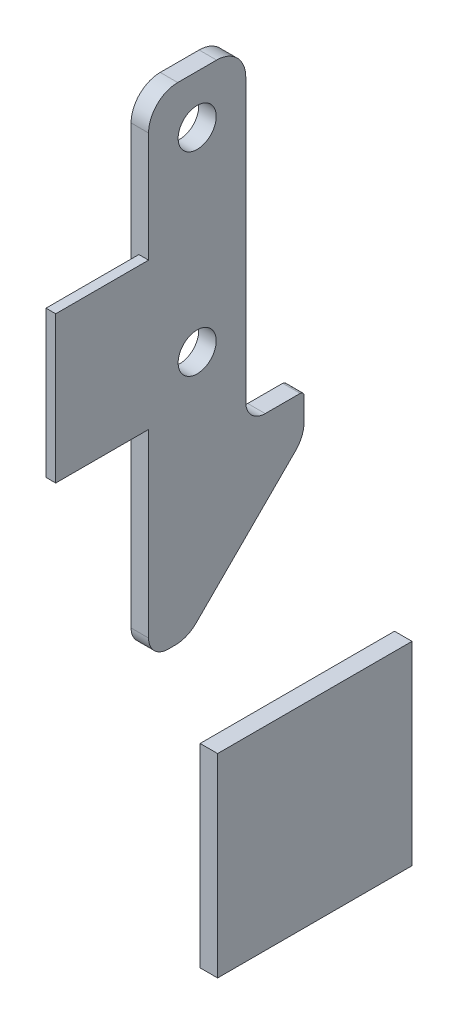
ISO-10303-21;
HEADER;
FILE_DESCRIPTION(('STEP AP214'),'2;1');
FILE_NAME('part.step','',(''),(''),'','','');
FILE_SCHEMA(('AUTOMOTIVE_DESIGN { 1 0 10303 214 1 1 1 1 }'));
ENDSEC;
DATA;
#1=APPLICATION_CONTEXT('core data for automotive mechanical design processes');
#2=APPLICATION_PROTOCOL_DEFINITION('international standard','automotive_design',2000,#1);
#3=PRODUCT_CONTEXT('',#1,'mechanical');
#4=PRODUCT('Part','Part','',(#3));
#5=PRODUCT_RELATED_PRODUCT_CATEGORY('part','',(#4));
#6=PRODUCT_DEFINITION_FORMATION('','',#4);
#7=PRODUCT_DEFINITION_CONTEXT('part definition',#1,'design');
#8=PRODUCT_DEFINITION('design','',#6,#7);
#9=PRODUCT_DEFINITION_SHAPE('','',#8);
#10=(LENGTH_UNIT() NAMED_UNIT(*) SI_UNIT(.MILLI.,.METRE.));
#11=(NAMED_UNIT(*) PLANE_ANGLE_UNIT() SI_UNIT($,.RADIAN.));
#12=(NAMED_UNIT(*) SI_UNIT($,.STERADIAN.) SOLID_ANGLE_UNIT());
#13=UNCERTAINTY_MEASURE_WITH_UNIT(LENGTH_MEASURE(1.E-05),#10,'distance_accuracy_value','');
#14=(GEOMETRIC_REPRESENTATION_CONTEXT(3) GLOBAL_UNCERTAINTY_ASSIGNED_CONTEXT((#13)) GLOBAL_UNIT_ASSIGNED_CONTEXT((#10,
#11,#12)) REPRESENTATION_CONTEXT('',''));
#15=CARTESIAN_POINT('',(0.,0.,0.));
#16=DIRECTION('',(0.,0.,1.));
#17=DIRECTION('',(1.,0.,0.));
#18=AXIS2_PLACEMENT_3D('',#15,#16,#17);
#19=CARTESIAN_POINT('',(-1.143,0.,0.));
#20=DIRECTION('',(-1.,0.,0.));
#21=DIRECTION('',(0.,0.,1.));
#22=AXIS2_PLACEMENT_3D('',#19,#20,#21);
#23=PLANE('',#22);
#24=DIRECTION('',(0.,-1.,0.));
#25=VECTOR('',#24,1.);
#26=CARTESIAN_POINT('',(-1.143,-72.1927963199012,-2.67214499586998));
#27=LINE('',#26,#25);
#28=CARTESIAN_POINT('',(-1.143,-72.1927963199012,-2.67214499586998));
#29=VERTEX_POINT('',#28);
#30=CARTESIAN_POINT('',(-1.143,-97.5927963199013,-2.67214499586998));
#31=VERTEX_POINT('',#30);
#32=EDGE_CURVE('E56',#29,#31,#27,.T.);
#33=ORIENTED_EDGE('',*,*,#32,.F.);
#34=DIRECTION('',(0.,0.,1.));
#35=VECTOR('',#34,1.);
#36=CARTESIAN_POINT('',(-1.143,-72.1927963199012,-2.67214499586998));
#37=LINE('',#36,#35);
#38=CARTESIAN_POINT('',(-1.143,-72.1927963199012,-28.07214499587));
#39=VERTEX_POINT('',#38);
#40=EDGE_CURVE('E79',#39,#29,#37,.T.);
#41=ORIENTED_EDGE('',*,*,#40,.F.);
#42=DIRECTION('',(0.,1.,0.));
#43=VECTOR('',#42,1.);
#44=CARTESIAN_POINT('',(-1.143,-72.1927963199012,-28.07214499587));
#45=LINE('',#44,#43);
#46=CARTESIAN_POINT('',(-1.143,-97.5927963199013,-28.07214499587));
#47=VERTEX_POINT('',#46);
#48=EDGE_CURVE('E84',#47,#39,#45,.T.);
#49=ORIENTED_EDGE('',*,*,#48,.F.);
#50=DIRECTION('',(0.,0.,-1.));
#51=VECTOR('',#50,1.);
#52=CARTESIAN_POINT('',(-1.143,-97.5927963199013,-2.67214499586998));
#53=LINE('',#52,#51);
#54=EDGE_CURVE('E99',#31,#47,#53,.T.);
#55=ORIENTED_EDGE('',*,*,#54,.F.);
#56=EDGE_LOOP('',(#33,#41,#49,#55));
#57=FACE_BOUND('',#56,.T.);
#58=ADVANCED_FACE('F47',(#57),#23,.T.);
#59=CARTESIAN_POINT('',(1.143,0.,0.));
#60=DIRECTION('',(1.,0.,0.));
#61=DIRECTION('',(0.,0.,-1.));
#62=AXIS2_PLACEMENT_3D('',#59,#60,#61);
#63=PLANE('',#62);
#64=DIRECTION('',(0.,-1.,0.));
#65=VECTOR('',#64,1.);
#66=CARTESIAN_POINT('',(1.143,-72.1927963199012,-2.67214499586998));
#67=LINE('',#66,#65);
#68=CARTESIAN_POINT('',(1.143,-72.1927963199012,-2.67214499586998));
#69=VERTEX_POINT('',#68);
#70=CARTESIAN_POINT('',(1.143,-97.5927963199013,-2.67214499586998));
#71=VERTEX_POINT('',#70);
#72=EDGE_CURVE('E108',#69,#71,#67,.T.);
#73=ORIENTED_EDGE('',*,*,#72,.T.);
#74=DIRECTION('',(0.,0.,-1.));
#75=VECTOR('',#74,1.);
#76=CARTESIAN_POINT('',(1.143,-97.5927963199013,-2.67214499586998));
#77=LINE('',#76,#75);
#78=CARTESIAN_POINT('',(1.143,-97.5927963199013,-28.07214499587));
#79=VERTEX_POINT('',#78);
#80=EDGE_CURVE('E97',#71,#79,#77,.T.);
#81=ORIENTED_EDGE('',*,*,#80,.T.);
#82=DIRECTION('',(0.,1.,0.));
#83=VECTOR('',#82,1.);
#84=CARTESIAN_POINT('',(1.143,-72.1927963199012,-28.07214499587));
#85=LINE('',#84,#83);
#86=CARTESIAN_POINT('',(1.143,-72.1927963199012,-28.07214499587));
#87=VERTEX_POINT('',#86);
#88=EDGE_CURVE('E100',#79,#87,#85,.T.);
#89=ORIENTED_EDGE('',*,*,#88,.T.);
#90=DIRECTION('',(0.,0.,1.));
#91=VECTOR('',#90,1.);
#92=CARTESIAN_POINT('',(1.143,-72.1927963199012,-2.67214499586998));
#93=LINE('',#92,#91);
#94=EDGE_CURVE('E105',#87,#69,#93,.T.);
#95=ORIENTED_EDGE('',*,*,#94,.T.);
#96=EDGE_LOOP('',(#73,#81,#89,#95));
#97=FACE_BOUND('',#96,.T.);
#98=ADVANCED_FACE('F107',(#97),#63,.T.);
#99=CARTESIAN_POINT('',(-37.0640244842766,-97.5927963199013,-2.67214499586998));
#100=DIRECTION('',(0.,-1.,0.));
#101=DIRECTION('',(0.,0.,-1.));
#102=AXIS2_PLACEMENT_3D('',#99,#100,#101);
#103=PLANE('',#102);
#104=DIRECTION('',(1.,0.,0.));
#105=VECTOR('',#104,1.);
#106=CARTESIAN_POINT('',(-37.0640244842766,-97.5927963199013,-2.67214499586998));
#107=LINE('',#106,#105);
#108=EDGE_CURVE('E13',#31,#71,#107,.T.);
#109=ORIENTED_EDGE('',*,*,#108,.F.);
#110=ORIENTED_EDGE('',*,*,#54,.T.);
#111=DIRECTION('',(1.,0.,0.));
#112=VECTOR('',#111,1.);
#113=CARTESIAN_POINT('',(-37.0640244842766,-97.5927963199013,-28.07214499587));
#114=LINE('',#113,#112);
#115=EDGE_CURVE('E94',#47,#79,#114,.T.);
#116=ORIENTED_EDGE('',*,*,#115,.T.);
#117=ORIENTED_EDGE('',*,*,#80,.F.);
#118=EDGE_LOOP('',(#109,#110,#116,#117));
#119=FACE_BOUND('',#118,.T.);
#120=ADVANCED_FACE('F95',(#119),#103,.T.);
#121=CARTESIAN_POINT('',(-37.0640244842766,-72.1927963199012,-28.07214499587));
#122=DIRECTION('',(0.,0.,-1.));
#123=DIRECTION('',(0.,1.,0.));
#124=AXIS2_PLACEMENT_3D('',#121,#122,#123);
#125=PLANE('',#124);
#126=ORIENTED_EDGE('',*,*,#115,.F.);
#127=ORIENTED_EDGE('',*,*,#48,.T.);
#128=DIRECTION('',(1.,0.,0.));
#129=VECTOR('',#128,1.);
#130=CARTESIAN_POINT('',(-37.0640244842766,-72.1927963199012,-28.07214499587));
#131=LINE('',#130,#129);
#132=EDGE_CURVE('E89',#39,#87,#131,.T.);
#133=ORIENTED_EDGE('',*,*,#132,.T.);
#134=ORIENTED_EDGE('',*,*,#88,.F.);
#135=EDGE_LOOP('',(#126,#127,#133,#134));
#136=FACE_BOUND('',#135,.T.);
#137=ADVANCED_FACE('F101',(#136),#125,.T.);
#138=CARTESIAN_POINT('',(-37.0640244842766,-72.1927963199012,-2.67214499586998));
#139=DIRECTION('',(0.,1.,0.));
#140=DIRECTION('',(0.,0.,1.));
#141=AXIS2_PLACEMENT_3D('',#138,#139,#140);
#142=PLANE('',#141);
#143=ORIENTED_EDGE('',*,*,#132,.F.);
#144=ORIENTED_EDGE('',*,*,#40,.T.);
#145=DIRECTION('',(1.,0.,0.));
#146=VECTOR('',#145,1.);
#147=CARTESIAN_POINT('',(-37.0640244842766,-72.1927963199012,-2.67214499586998));
#148=LINE('',#147,#146);
#149=EDGE_CURVE('E127',#29,#69,#148,.T.);
#150=ORIENTED_EDGE('',*,*,#149,.T.);
#151=ORIENTED_EDGE('',*,*,#94,.F.);
#152=EDGE_LOOP('',(#143,#144,#150,#151));
#153=FACE_BOUND('',#152,.T.);
#154=ADVANCED_FACE('F141',(#153),#142,.T.);
#155=CARTESIAN_POINT('',(-37.0640244842766,-72.1927963199012,-2.67214499586998));
#156=DIRECTION('',(0.,0.,1.));
#157=DIRECTION('',(0.,-1.,0.));
#158=AXIS2_PLACEMENT_3D('',#155,#156,#157);
#159=PLANE('',#158);
#160=ORIENTED_EDGE('',*,*,#149,.F.);
#161=ORIENTED_EDGE('',*,*,#32,.T.);
#162=ORIENTED_EDGE('',*,*,#108,.T.);
#163=ORIENTED_EDGE('',*,*,#72,.F.);
#164=EDGE_LOOP('',(#160,#161,#162,#163));
#165=FACE_BOUND('',#164,.T.);
#166=ADVANCED_FACE('F143',(#165),#159,.T.);
#167=CLOSED_SHELL('',(#58,#98,#120,#137,#154,#166));
#168=MANIFOLD_SOLID_BREP('B2',#167);
#169=CARTESIAN_POINT('',(1.143,0.,0.));
#170=DIRECTION('',(-1.,0.,0.));
#171=DIRECTION('',(0.,0.,1.));
#172=AXIS2_PLACEMENT_3D('',#169,#170,#171);
#173=PLANE('',#172);
#174=DIRECTION('',(0.,-1.,0.));
#175=VECTOR('',#174,1.);
#176=CARTESIAN_POINT('',(1.143,-57.1500000000001,6.35));
#177=LINE('',#176,#175);
#178=CARTESIAN_POINT('',(1.143,2.54,6.35));
#179=VERTEX_POINT('',#178);
#180=CARTESIAN_POINT('',(1.143,-11.8471085961858,6.35));
#181=VERTEX_POINT('',#180);
#182=EDGE_CURVE('E385',#179,#181,#177,.T.);
#183=ORIENTED_EDGE('',*,*,#182,.T.);
#184=DIRECTION('',(0.,0.,1.));
#185=VECTOR('',#184,1.);
#186=CARTESIAN_POINT('',(1.143,-11.8471085961858,6.35));
#187=LINE('',#186,#185);
#188=CARTESIAN_POINT('',(1.143,-11.8471085961858,18.4831558357814));
#189=VERTEX_POINT('',#188);
#190=EDGE_CURVE('E323',#181,#189,#187,.T.);
#191=ORIENTED_EDGE('',*,*,#190,.T.);
#192=DIRECTION('',(0.,-1.,0.));
#193=VECTOR('',#192,1.);
#194=CARTESIAN_POINT('',(1.143,-31.0059207664608,18.4831558357814));
#195=LINE('',#194,#193);
#196=CARTESIAN_POINT('',(1.143,-31.0059207664608,18.4831558357814));
#197=VERTEX_POINT('',#196);
#198=EDGE_CURVE('E344',#189,#197,#195,.T.);
#199=ORIENTED_EDGE('',*,*,#198,.T.);
#200=DIRECTION('',(0.,0.,-1.));
#201=VECTOR('',#200,1.);
#202=CARTESIAN_POINT('',(1.143,-31.0059207664608,6.35));
#203=LINE('',#202,#201);
#204=CARTESIAN_POINT('',(1.143,-31.0059207664608,6.35));
#205=VERTEX_POINT('',#204);
#206=EDGE_CURVE('E209',#197,#205,#203,.T.);
#207=ORIENTED_EDGE('',*,*,#206,.T.);
#208=CARTESIAN_POINT('',(1.143,-54.6100000000001,6.35));
#209=VERTEX_POINT('',#208);
#210=EDGE_CURVE('E213',#205,#209,#177,.T.);
#211=ORIENTED_EDGE('',*,*,#210,.T.);
#212=CARTESIAN_POINT('',(1.143,-54.6100000000001,3.81));
#213=DIRECTION('',(-1.,0.,0.));
#214=DIRECTION('',(0.,0.,1.));
#215=AXIS2_PLACEMENT_3D('',#212,#213,#214);
#216=CIRCLE('',#215,2.54);
#217=CARTESIAN_POINT('',(1.143,-57.1500000000001,3.81));
#218=VERTEX_POINT('',#217);
#219=EDGE_CURVE('E45',#209,#218,#216,.F.);
#220=ORIENTED_EDGE('',*,*,#219,.T.);
#221=DIRECTION('',(0.,0.,-1.));
#222=VECTOR('',#221,1.);
#223=CARTESIAN_POINT('',(1.143,-57.1500000000001,1.27));
#224=LINE('',#223,#222);
#225=CARTESIAN_POINT('',(1.143,-57.1500000000001,2.84815367264149));
#226=VERTEX_POINT('',#225);
#227=EDGE_CURVE('E486',#218,#226,#224,.T.);
#228=ORIENTED_EDGE('',*,*,#227,.T.);
#229=CARTESIAN_POINT('',(1.143,-53.3400000000001,2.84815367264149));
#230=DIRECTION('',(-1.,0.,0.));
#231=DIRECTION('',(0.,0.,1.));
#232=AXIS2_PLACEMENT_3D('',#229,#230,#231);
#233=CIRCLE('',#232,3.81);
#234=CARTESIAN_POINT('',(1.143,-56.0340768363208,0.15407683632074));
#235=VERTEX_POINT('',#234);
#236=EDGE_CURVE('E528',#226,#235,#233,.F.);
#237=ORIENTED_EDGE('',*,*,#236,.T.);
#238=DIRECTION('',(0.,0.707106781186549,-0.707106781186546));
#239=VECTOR('',#238,1.);
#240=CARTESIAN_POINT('',(1.143,-41.91,-13.97));
#241=LINE('',#240,#239);
#242=CARTESIAN_POINT('',(1.143,-43.0259231636793,-12.8540768363208));
#243=VERTEX_POINT('',#242);
#244=EDGE_CURVE('E488',#235,#243,#241,.T.);
#245=ORIENTED_EDGE('',*,*,#244,.T.);
#246=CARTESIAN_POINT('',(1.143,-40.3318463273585,-10.16));
#247=DIRECTION('',(-1.,0.,0.));
#248=DIRECTION('',(0.,0.,1.));
#249=AXIS2_PLACEMENT_3D('',#246,#247,#248);
#250=CIRCLE('',#249,3.81);
#251=CARTESIAN_POINT('',(1.143,-40.3318463273585,-13.97));
#252=VERTEX_POINT('',#251);
#253=EDGE_CURVE('E499',#243,#252,#250,.F.);
#254=ORIENTED_EDGE('',*,*,#253,.T.);
#255=DIRECTION('',(0.,1.,0.));
#256=VECTOR('',#255,1.);
#257=CARTESIAN_POINT('',(1.143,-36.83,-13.97));
#258=LINE('',#257,#256);
#259=CARTESIAN_POINT('',(1.143,-37.338,-13.97));
#260=VERTEX_POINT('',#259);
#261=EDGE_CURVE('E403',#252,#260,#258,.T.);
#262=ORIENTED_EDGE('',*,*,#261,.T.);
#263=CARTESIAN_POINT('',(1.143,-37.338,-13.462));
#264=DIRECTION('',(-1.,0.,0.));
#265=DIRECTION('',(0.,0.,1.));
#266=AXIS2_PLACEMENT_3D('',#263,#264,#265);
#267=CIRCLE('',#266,0.508);
#268=CARTESIAN_POINT('',(1.143,-36.83,-13.462));
#269=VERTEX_POINT('',#268);
#270=EDGE_CURVE('E497',#260,#269,#267,.F.);
#271=ORIENTED_EDGE('',*,*,#270,.T.);
#272=DIRECTION('',(0.,0.,1.));
#273=VECTOR('',#272,1.);
#274=CARTESIAN_POINT('',(1.143,-36.83,-6.35));
#275=LINE('',#274,#273);
#276=CARTESIAN_POINT('',(1.143,-36.83,-8.89000000000001));
#277=VERTEX_POINT('',#276);
#278=EDGE_CURVE('E398',#269,#277,#275,.T.);
#279=ORIENTED_EDGE('',*,*,#278,.T.);
#280=CARTESIAN_POINT('',(1.143,-34.29,-8.89000000000001));
#281=DIRECTION('',(-1.,0.,0.));
#282=DIRECTION('',(0.,0.,1.));
#283=AXIS2_PLACEMENT_3D('',#280,#281,#282);
#284=CIRCLE('',#283,2.54);
#285=CARTESIAN_POINT('',(1.143,-34.29,-6.35));
#286=VERTEX_POINT('',#285);
#287=EDGE_CURVE('E431',#277,#286,#284,.T.);
#288=ORIENTED_EDGE('',*,*,#287,.T.);
#289=DIRECTION('',(0.,1.,0.));
#290=VECTOR('',#289,1.);
#291=CARTESIAN_POINT('',(1.143,6.35,-6.35));
#292=LINE('',#291,#290);
#293=CARTESIAN_POINT('',(1.143,2.54,-6.35));
#294=VERTEX_POINT('',#293);
#295=EDGE_CURVE('E402',#286,#294,#292,.T.);
#296=ORIENTED_EDGE('',*,*,#295,.T.);
#297=CARTESIAN_POINT('',(1.143,2.54,-2.54));
#298=DIRECTION('',(-1.,0.,0.));
#299=DIRECTION('',(0.,0.,1.));
#300=AXIS2_PLACEMENT_3D('',#297,#298,#299);
#301=CIRCLE('',#300,3.81);
#302=CARTESIAN_POINT('',(1.143,6.35,-2.54));
#303=VERTEX_POINT('',#302);
#304=EDGE_CURVE('E523',#294,#303,#301,.F.);
#305=ORIENTED_EDGE('',*,*,#304,.T.);
#306=DIRECTION('',(0.,0.,1.));
#307=VECTOR('',#306,1.);
#308=CARTESIAN_POINT('',(1.143,6.35,6.35));
#309=LINE('',#308,#307);
#310=CARTESIAN_POINT('',(1.143,6.35,2.54));
#311=VERTEX_POINT('',#310);
#312=EDGE_CURVE('E380',#303,#311,#309,.T.);
#313=ORIENTED_EDGE('',*,*,#312,.T.);
#314=CARTESIAN_POINT('',(1.143,2.54,2.54));
#315=DIRECTION('',(-1.,0.,0.));
#316=DIRECTION('',(0.,0.,1.));
#317=AXIS2_PLACEMENT_3D('',#314,#315,#316);
#318=CIRCLE('',#317,3.81);
#319=EDGE_CURVE('E521',#311,#179,#318,.F.);
#320=ORIENTED_EDGE('',*,*,#319,.T.);
#321=EDGE_LOOP('',(#183,#191,#199,#207,#211,#220,#228,#237,#245,#254,#262,#271,#279,#288,#296,
#305,#313,#320));
#322=FACE_BOUND('',#321,.T.);
#323=CARTESIAN_POINT('',(1.143,0.,0.));
#324=DIRECTION('',(1.,0.,0.));
#325=DIRECTION('',(0.,0.,-1.));
#326=AXIS2_PLACEMENT_3D('',#323,#324,#325);
#327=CIRCLE('',#326,2.4892);
#328=CARTESIAN_POINT('',(1.143,0.,-2.4892));
#329=VERTEX_POINT('',#328);
#330=EDGE_CURVE('E378',#329,#329,#327,.T.);
#331=ORIENTED_EDGE('',*,*,#330,.F.);
#332=EDGE_LOOP('',(#331));
#333=FACE_BOUND('',#332,.T.);
#334=CARTESIAN_POINT('',(1.143,-25.4,0.));
#335=DIRECTION('',(1.,0.,0.));
#336=DIRECTION('',(0.,0.,-1.));
#337=AXIS2_PLACEMENT_3D('',#334,#335,#336);
#338=CIRCLE('',#337,2.4892);
#339=CARTESIAN_POINT('',(1.143,-25.4,-2.4892));
#340=VERTEX_POINT('',#339);
#341=EDGE_CURVE('E361',#340,#340,#338,.T.);
#342=ORIENTED_EDGE('',*,*,#341,.F.);
#343=EDGE_LOOP('',(#342));
#344=FACE_BOUND('',#343,.T.);
#345=ADVANCED_FACE('F194',(#322,#333,#344),#173,.F.);
#346=CARTESIAN_POINT('',(-1.143,0.,0.));
#347=DIRECTION('',(-1.,0.,0.));
#348=DIRECTION('',(0.,0.,1.));
#349=AXIS2_PLACEMENT_3D('',#346,#347,#348);
#350=PLANE('',#349);
#351=CARTESIAN_POINT('',(-1.143,0.,0.));
#352=DIRECTION('',(1.,0.,0.));
#353=DIRECTION('',(0.,0.,-1.));
#354=AXIS2_PLACEMENT_3D('',#351,#352,#353);
#355=CIRCLE('',#354,2.4892);
#356=CARTESIAN_POINT('',(-1.143,0.,-2.4892));
#357=VERTEX_POINT('',#356);
#358=EDGE_CURVE('E365',#357,#357,#355,.T.);
#359=ORIENTED_EDGE('',*,*,#358,.T.);
#360=EDGE_LOOP('',(#359));
#361=FACE_BOUND('',#360,.T.);
#362=DIRECTION('',(0.,0.,-1.));
#363=VECTOR('',#362,1.);
#364=CARTESIAN_POINT('',(-1.143,-57.1500000000001,1.27));
#365=LINE('',#364,#363);
#366=CARTESIAN_POINT('',(-1.143,-57.1500000000001,3.81));
#367=VERTEX_POINT('',#366);
#368=CARTESIAN_POINT('',(-1.143,-57.1500000000001,2.84815367264149));
#369=VERTEX_POINT('',#368);
#370=EDGE_CURVE('E474',#367,#369,#365,.T.);
#371=ORIENTED_EDGE('',*,*,#370,.F.);
#372=CARTESIAN_POINT('',(-1.143,-54.6100000000001,3.81));
#373=DIRECTION('',(-1.,0.,0.));
#374=DIRECTION('',(0.,0.,1.));
#375=AXIS2_PLACEMENT_3D('',#372,#373,#374);
#376=CIRCLE('',#375,2.54);
#377=CARTESIAN_POINT('',(-1.143,-54.6100000000001,6.35));
#378=VERTEX_POINT('',#377);
#379=EDGE_CURVE('E559',#367,#378,#376,.T.);
#380=ORIENTED_EDGE('',*,*,#379,.T.);
#381=DIRECTION('',(0.,-1.,0.));
#382=VECTOR('',#381,1.);
#383=CARTESIAN_POINT('',(-1.143,-57.1500000000001,6.35));
#384=LINE('',#383,#382);
#385=CARTESIAN_POINT('',(-1.143,2.54,6.35));
#386=VERTEX_POINT('',#385);
#387=EDGE_CURVE('E470',#386,#378,#384,.T.);
#388=ORIENTED_EDGE('',*,*,#387,.F.);
#389=CARTESIAN_POINT('',(-1.143,2.54,2.54));
#390=DIRECTION('',(-1.,0.,0.));
#391=DIRECTION('',(0.,0.,1.));
#392=AXIS2_PLACEMENT_3D('',#389,#390,#391);
#393=CIRCLE('',#392,3.81);
#394=CARTESIAN_POINT('',(-1.143,6.35,2.54));
#395=VERTEX_POINT('',#394);
#396=EDGE_CURVE('E459',#386,#395,#393,.T.);
#397=ORIENTED_EDGE('',*,*,#396,.T.);
#398=DIRECTION('',(0.,0.,1.));
#399=VECTOR('',#398,1.);
#400=CARTESIAN_POINT('',(-1.143,6.35,6.35));
#401=LINE('',#400,#399);
#402=CARTESIAN_POINT('',(-1.143,6.35,-2.54));
#403=VERTEX_POINT('',#402);
#404=EDGE_CURVE('E410',#403,#395,#401,.T.);
#405=ORIENTED_EDGE('',*,*,#404,.F.);
#406=CARTESIAN_POINT('',(-1.143,2.54,-2.54));
#407=DIRECTION('',(-1.,0.,0.));
#408=DIRECTION('',(0.,0.,1.));
#409=AXIS2_PLACEMENT_3D('',#406,#407,#408);
#410=CIRCLE('',#409,3.81);
#411=CARTESIAN_POINT('',(-1.143,2.54,-6.35));
#412=VERTEX_POINT('',#411);
#413=EDGE_CURVE('E461',#403,#412,#410,.T.);
#414=ORIENTED_EDGE('',*,*,#413,.T.);
#415=DIRECTION('',(0.,1.,0.));
#416=VECTOR('',#415,1.);
#417=CARTESIAN_POINT('',(-1.143,6.35,-6.35));
#418=LINE('',#417,#416);
#419=CARTESIAN_POINT('',(-1.143,-34.29,-6.35));
#420=VERTEX_POINT('',#419);
#421=EDGE_CURVE('E384',#420,#412,#418,.T.);
#422=ORIENTED_EDGE('',*,*,#421,.F.);
#423=CARTESIAN_POINT('',(-1.143,-34.29,-8.89000000000001));
#424=DIRECTION('',(-1.,0.,0.));
#425=DIRECTION('',(0.,0.,1.));
#426=AXIS2_PLACEMENT_3D('',#423,#424,#425);
#427=CIRCLE('',#426,2.54);
#428=CARTESIAN_POINT('',(-1.143,-36.83,-8.89000000000001));
#429=VERTEX_POINT('',#428);
#430=EDGE_CURVE('E429',#420,#429,#427,.F.);
#431=ORIENTED_EDGE('',*,*,#430,.T.);
#432=DIRECTION('',(0.,0.,1.));
#433=VECTOR('',#432,1.);
#434=CARTESIAN_POINT('',(-1.143,-36.83,-6.35));
#435=LINE('',#434,#433);
#436=CARTESIAN_POINT('',(-1.143,-36.83,-13.462));
#437=VERTEX_POINT('',#436);
#438=EDGE_CURVE('E592',#437,#429,#435,.T.);
#439=ORIENTED_EDGE('',*,*,#438,.F.);
#440=CARTESIAN_POINT('',(-1.143,-37.338,-13.462));
#441=DIRECTION('',(-1.,0.,0.));
#442=DIRECTION('',(0.,0.,1.));
#443=AXIS2_PLACEMENT_3D('',#440,#441,#442);
#444=CIRCLE('',#443,0.508);
#445=CARTESIAN_POINT('',(-1.143,-37.338,-13.97));
#446=VERTEX_POINT('',#445);
#447=EDGE_CURVE('E438',#437,#446,#444,.T.);
#448=ORIENTED_EDGE('',*,*,#447,.T.);
#449=DIRECTION('',(0.,1.,0.));
#450=VECTOR('',#449,1.);
#451=CARTESIAN_POINT('',(-1.143,-36.83,-13.97));
#452=LINE('',#451,#450);
#453=CARTESIAN_POINT('',(-1.143,-40.3318463273585,-13.97));
#454=VERTEX_POINT('',#453);
#455=EDGE_CURVE('E507',#454,#446,#452,.T.);
#456=ORIENTED_EDGE('',*,*,#455,.F.);
#457=CARTESIAN_POINT('',(-1.143,-40.3318463273585,-10.16));
#458=DIRECTION('',(-1.,0.,0.));
#459=DIRECTION('',(0.,0.,1.));
#460=AXIS2_PLACEMENT_3D('',#457,#458,#459);
#461=CIRCLE('',#460,3.81);
#462=CARTESIAN_POINT('',(-1.143,-43.0259231636793,-12.8540768363208));
#463=VERTEX_POINT('',#462);
#464=EDGE_CURVE('E451',#454,#463,#461,.T.);
#465=ORIENTED_EDGE('',*,*,#464,.T.);
#466=DIRECTION('',(0.,0.707106781186549,-0.707106781186546));
#467=VECTOR('',#466,1.);
#468=CARTESIAN_POINT('',(-1.143,-41.91,-13.97));
#469=LINE('',#468,#467);
#470=CARTESIAN_POINT('',(-1.143,-56.0340768363208,0.15407683632074));
#471=VERTEX_POINT('',#470);
#472=EDGE_CURVE('E477',#471,#463,#469,.T.);
#473=ORIENTED_EDGE('',*,*,#472,.F.);
#474=CARTESIAN_POINT('',(-1.143,-53.3400000000001,2.84815367264149));
#475=DIRECTION('',(-1.,0.,0.));
#476=DIRECTION('',(0.,0.,1.));
#477=AXIS2_PLACEMENT_3D('',#474,#475,#476);
#478=CIRCLE('',#477,3.81);
#479=EDGE_CURVE('E455',#471,#369,#478,.T.);
#480=ORIENTED_EDGE('',*,*,#479,.T.);
#481=EDGE_LOOP('',(#371,#380,#388,#397,#405,#414,#422,#431,#439,#448,#456,#465,#473,#480));
#482=FACE_BOUND('',#481,.T.);
#483=CARTESIAN_POINT('',(-1.143,-25.4,0.));
#484=DIRECTION('',(1.,0.,0.));
#485=DIRECTION('',(0.,0.,-1.));
#486=AXIS2_PLACEMENT_3D('',#483,#484,#485);
#487=CIRCLE('',#486,2.4892);
#488=CARTESIAN_POINT('',(-1.143,-25.4,-2.4892));
#489=VERTEX_POINT('',#488);
#490=EDGE_CURVE('E366',#489,#489,#487,.T.);
#491=ORIENTED_EDGE('',*,*,#490,.T.);
#492=EDGE_LOOP('',(#491));
#493=FACE_BOUND('',#492,.T.);
#494=ADVANCED_FACE('F557',(#361,#482,#493),#350,.T.);
#495=CARTESIAN_POINT('',(1.143,6.35,6.35));
#496=DIRECTION('',(0.,-1.,0.));
#497=DIRECTION('',(0.,0.,-1.));
#498=AXIS2_PLACEMENT_3D('',#495,#496,#497);
#499=PLANE('',#498);
#500=ORIENTED_EDGE('',*,*,#312,.F.);
#501=DIRECTION('',(-1.,0.,0.));
#502=VECTOR('',#501,1.);
#503=CARTESIAN_POINT('',(1.143,6.35,-2.54));
#504=LINE('',#503,#502);
#505=EDGE_CURVE('E447',#303,#403,#504,.T.);
#506=ORIENTED_EDGE('',*,*,#505,.T.);
#507=ORIENTED_EDGE('',*,*,#404,.T.);
#508=DIRECTION('',(-1.,0.,0.));
#509=VECTOR('',#508,1.);
#510=CARTESIAN_POINT('',(1.143,6.35,2.54));
#511=LINE('',#510,#509);
#512=EDGE_CURVE('E452',#395,#311,#511,.F.);
#513=ORIENTED_EDGE('',*,*,#512,.T.);
#514=EDGE_LOOP('',(#500,#506,#507,#513));
#515=FACE_BOUND('',#514,.T.);
#516=ADVANCED_FACE('F516',(#515),#499,.F.);
#517=CARTESIAN_POINT('',(1.143,-57.1500000000001,6.35));
#518=DIRECTION('',(0.,0.,-1.));
#519=DIRECTION('',(0.,1.,0.));
#520=AXIS2_PLACEMENT_3D('',#517,#518,#519);
#521=PLANE('',#520);
#522=ORIENTED_EDGE('',*,*,#210,.F.);
#523=DIRECTION('',(1.,0.,0.));
#524=VECTOR('',#523,1.);
#525=CARTESIAN_POINT('',(-0.127,-31.0059207664608,6.35));
#526=LINE('',#525,#524);
#527=CARTESIAN_POINT('',(-0.127,-31.0059207664608,6.35));
#528=VERTEX_POINT('',#527);
#529=EDGE_CURVE('E342',#528,#205,#526,.T.);
#530=ORIENTED_EDGE('',*,*,#529,.F.);
#531=DIRECTION('',(0.,1.,0.));
#532=VECTOR('',#531,1.);
#533=CARTESIAN_POINT('',(-0.127,-31.0059207664608,6.35));
#534=LINE('',#533,#532);
#535=CARTESIAN_POINT('',(-0.127,-11.8471085961858,6.35));
#536=VERTEX_POINT('',#535);
#537=EDGE_CURVE('E335',#528,#536,#534,.T.);
#538=ORIENTED_EDGE('',*,*,#537,.T.);
#539=DIRECTION('',(1.,0.,0.));
#540=VECTOR('',#539,1.);
#541=CARTESIAN_POINT('',(-0.127,-11.8471085961858,6.35));
#542=LINE('',#541,#540);
#543=EDGE_CURVE('E318',#536,#181,#542,.T.);
#544=ORIENTED_EDGE('',*,*,#543,.T.);
#545=ORIENTED_EDGE('',*,*,#182,.F.);
#546=DIRECTION('',(-1.,0.,0.));
#547=VECTOR('',#546,1.);
#548=CARTESIAN_POINT('',(1.143,2.54,6.35));
#549=LINE('',#548,#547);
#550=EDGE_CURVE('E527',#179,#386,#549,.T.);
#551=ORIENTED_EDGE('',*,*,#550,.T.);
#552=ORIENTED_EDGE('',*,*,#387,.T.);
#553=DIRECTION('',(-1.,0.,0.));
#554=VECTOR('',#553,1.);
#555=CARTESIAN_POINT('',(1.143,-54.6100000000001,6.35));
#556=LINE('',#555,#554);
#557=EDGE_CURVE('E202',#378,#209,#556,.F.);
#558=ORIENTED_EDGE('',*,*,#557,.T.);
#559=EDGE_LOOP('',(#522,#530,#538,#544,#545,#551,#552,#558));
#560=FACE_BOUND('',#559,.T.);
#561=ADVANCED_FACE('F341',(#560),#521,.F.);
#562=CARTESIAN_POINT('',(1.143,-57.1500000000001,1.27));
#563=DIRECTION('',(0.,1.,0.));
#564=DIRECTION('',(0.,0.,1.));
#565=AXIS2_PLACEMENT_3D('',#562,#563,#564);
#566=PLANE('',#565);
#567=ORIENTED_EDGE('',*,*,#227,.F.);
#568=DIRECTION('',(-1.,0.,0.));
#569=VECTOR('',#568,1.);
#570=CARTESIAN_POINT('',(1.143,-57.1500000000001,3.81));
#571=LINE('',#570,#569);
#572=EDGE_CURVE('E563',#218,#367,#571,.T.);
#573=ORIENTED_EDGE('',*,*,#572,.T.);
#574=ORIENTED_EDGE('',*,*,#370,.T.);
#575=DIRECTION('',(-1.,0.,0.));
#576=VECTOR('',#575,1.);
#577=CARTESIAN_POINT('',(1.143,-57.1500000000001,2.84815367264149));
#578=LINE('',#577,#576);
#579=EDGE_CURVE('E570',#369,#226,#578,.F.);
#580=ORIENTED_EDGE('',*,*,#579,.T.);
#581=EDGE_LOOP('',(#567,#573,#574,#580));
#582=FACE_BOUND('',#581,.T.);
#583=ADVANCED_FACE('F625',(#582),#566,.F.);
#584=CARTESIAN_POINT('',(1.143,-41.91,-13.97));
#585=DIRECTION('',(0.,0.707106781186546,0.707106781186549));
#586=DIRECTION('',(0.,-0.707106781186549,0.707106781186546));
#587=AXIS2_PLACEMENT_3D('',#584,#585,#586);
#588=PLANE('',#587);
#589=ORIENTED_EDGE('',*,*,#244,.F.);
#590=DIRECTION('',(-1.,0.,0.));
#591=VECTOR('',#590,1.);
#592=CARTESIAN_POINT('',(1.143,-56.0340768363208,0.154076836320743));
#593=LINE('',#592,#591);
#594=EDGE_CURVE('E571',#235,#471,#593,.T.);
#595=ORIENTED_EDGE('',*,*,#594,.T.);
#596=ORIENTED_EDGE('',*,*,#472,.T.);
#597=DIRECTION('',(-1.,0.,0.));
#598=VECTOR('',#597,1.);
#599=CARTESIAN_POINT('',(1.143,-43.0259231636793,-12.8540768363208));
#600=LINE('',#599,#598);
#601=EDGE_CURVE('E536',#463,#243,#600,.F.);
#602=ORIENTED_EDGE('',*,*,#601,.T.);
#603=EDGE_LOOP('',(#589,#595,#596,#602));
#604=FACE_BOUND('',#603,.T.);
#605=ADVANCED_FACE('F580',(#604),#588,.F.);
#606=CARTESIAN_POINT('',(1.143,-36.83,-13.97));
#607=DIRECTION('',(0.,0.,1.));
#608=DIRECTION('',(1.,0.,0.));
#609=AXIS2_PLACEMENT_3D('',#606,#607,#608);
#610=PLANE('',#609);
#611=ORIENTED_EDGE('',*,*,#261,.F.);
#612=DIRECTION('',(-1.,0.,0.));
#613=VECTOR('',#612,1.);
#614=CARTESIAN_POINT('',(1.143,-40.3318463273585,-13.97));
#615=LINE('',#614,#613);
#616=EDGE_CURVE('E564',#252,#454,#615,.T.);
#617=ORIENTED_EDGE('',*,*,#616,.T.);
#618=ORIENTED_EDGE('',*,*,#455,.T.);
#619=DIRECTION('',(-1.,0.,0.));
#620=VECTOR('',#619,1.);
#621=CARTESIAN_POINT('',(1.143,-37.338,-13.97));
#622=LINE('',#621,#620);
#623=EDGE_CURVE('E504',#446,#260,#622,.F.);
#624=ORIENTED_EDGE('',*,*,#623,.T.);
#625=EDGE_LOOP('',(#611,#617,#618,#624));
#626=FACE_BOUND('',#625,.T.);
#627=ADVANCED_FACE('F505',(#626),#610,.F.);
#628=CARTESIAN_POINT('',(1.143,-36.83,-6.35));
#629=DIRECTION('',(0.,-1.,0.));
#630=DIRECTION('',(0.,0.,-1.));
#631=AXIS2_PLACEMENT_3D('',#628,#629,#630);
#632=PLANE('',#631);
#633=ORIENTED_EDGE('',*,*,#278,.F.);
#634=DIRECTION('',(-1.,0.,0.));
#635=VECTOR('',#634,1.);
#636=CARTESIAN_POINT('',(1.143,-36.83,-13.462));
#637=LINE('',#636,#635);
#638=EDGE_CURVE('E434',#269,#437,#637,.T.);
#639=ORIENTED_EDGE('',*,*,#638,.T.);
#640=ORIENTED_EDGE('',*,*,#438,.T.);
#641=DIRECTION('',(-1.,0.,0.));
#642=VECTOR('',#641,1.);
#643=CARTESIAN_POINT('',(1.143,-36.83,-8.89000000000001));
#644=LINE('',#643,#642);
#645=EDGE_CURVE('E424',#429,#277,#644,.F.);
#646=ORIENTED_EDGE('',*,*,#645,.T.);
#647=EDGE_LOOP('',(#633,#639,#640,#646));
#648=FACE_BOUND('',#647,.T.);
#649=ADVANCED_FACE('F617',(#648),#632,.F.);
#650=CARTESIAN_POINT('',(1.143,6.35,-6.35));
#651=DIRECTION('',(0.,0.,1.));
#652=DIRECTION('',(0.,-1.,0.));
#653=AXIS2_PLACEMENT_3D('',#650,#651,#652);
#654=PLANE('',#653);
#655=ORIENTED_EDGE('',*,*,#421,.T.);
#656=DIRECTION('',(-1.,0.,0.));
#657=VECTOR('',#656,1.);
#658=CARTESIAN_POINT('',(1.143,2.54,-6.35));
#659=LINE('',#658,#657);
#660=EDGE_CURVE('E583',#412,#294,#659,.F.);
#661=ORIENTED_EDGE('',*,*,#660,.T.);
#662=ORIENTED_EDGE('',*,*,#295,.F.);
#663=DIRECTION('',(-1.,0.,0.));
#664=VECTOR('',#663,1.);
#665=CARTESIAN_POINT('',(-1.143,-34.29,-6.35));
#666=LINE('',#665,#664);
#667=EDGE_CURVE('E409',#286,#420,#666,.T.);
#668=ORIENTED_EDGE('',*,*,#667,.T.);
#669=EDGE_LOOP('',(#655,#661,#662,#668));
#670=FACE_BOUND('',#669,.T.);
#671=ADVANCED_FACE('F590',(#670),#654,.F.);
#672=CARTESIAN_POINT('',(1.143,0.,0.));
#673=DIRECTION('',(-1.,0.,0.));
#674=DIRECTION('',(0.,0.,1.));
#675=AXIS2_PLACEMENT_3D('',#672,#673,#674);
#676=CYLINDRICAL_SURFACE('',#675,2.4892);
#677=ORIENTED_EDGE('',*,*,#330,.T.);
#678=EDGE_LOOP('',(#677));
#679=FACE_BOUND('',#678,.T.);
#680=ORIENTED_EDGE('',*,*,#358,.F.);
#681=EDGE_LOOP('',(#680));
#682=FACE_BOUND('',#681,.T.);
#683=ADVANCED_FACE('F612',(#679,#682),#676,.F.);
#684=CARTESIAN_POINT('',(1.143,-25.4,0.));
#685=DIRECTION('',(-1.,0.,0.));
#686=DIRECTION('',(0.,0.,1.));
#687=AXIS2_PLACEMENT_3D('',#684,#685,#686);
#688=CYLINDRICAL_SURFACE('',#687,2.4892);
#689=ORIENTED_EDGE('',*,*,#341,.T.);
#690=EDGE_LOOP('',(#689));
#691=FACE_BOUND('',#690,.T.);
#692=ORIENTED_EDGE('',*,*,#490,.F.);
#693=EDGE_LOOP('',(#692));
#694=FACE_BOUND('',#693,.T.);
#695=ADVANCED_FACE('F634',(#691,#694),#688,.F.);
#696=CARTESIAN_POINT('',(1.143,-34.29,-8.89000000000001));
#697=DIRECTION('',(1.,0.,0.));
#698=DIRECTION('',(0.,0.,-1.));
#699=AXIS2_PLACEMENT_3D('',#696,#697,#698);
#700=CYLINDRICAL_SURFACE('',#699,2.54);
#701=ORIENTED_EDGE('',*,*,#287,.F.);
#702=ORIENTED_EDGE('',*,*,#645,.F.);
#703=ORIENTED_EDGE('',*,*,#430,.F.);
#704=ORIENTED_EDGE('',*,*,#667,.F.);
#705=EDGE_LOOP('',(#701,#702,#703,#704));
#706=FACE_BOUND('',#705,.T.);
#707=ADVANCED_FACE('F602',(#706),#700,.F.);
#708=CARTESIAN_POINT('',(1.143,-37.338,-13.462));
#709=DIRECTION('',(-1.,0.,0.));
#710=DIRECTION('',(0.,0.,1.));
#711=AXIS2_PLACEMENT_3D('',#708,#709,#710);
#712=CYLINDRICAL_SURFACE('',#711,0.508);
#713=ORIENTED_EDGE('',*,*,#270,.F.);
#714=ORIENTED_EDGE('',*,*,#623,.F.);
#715=ORIENTED_EDGE('',*,*,#447,.F.);
#716=ORIENTED_EDGE('',*,*,#638,.F.);
#717=EDGE_LOOP('',(#713,#714,#715,#716));
#718=FACE_BOUND('',#717,.T.);
#719=ADVANCED_FACE('F511',(#718),#712,.T.);
#720=CARTESIAN_POINT('',(1.143,2.54,-2.54));
#721=DIRECTION('',(-1.,0.,0.));
#722=DIRECTION('',(0.,0.,1.));
#723=AXIS2_PLACEMENT_3D('',#720,#721,#722);
#724=CYLINDRICAL_SURFACE('',#723,3.81);
#725=ORIENTED_EDGE('',*,*,#304,.F.);
#726=ORIENTED_EDGE('',*,*,#660,.F.);
#727=ORIENTED_EDGE('',*,*,#413,.F.);
#728=ORIENTED_EDGE('',*,*,#505,.F.);
#729=EDGE_LOOP('',(#725,#726,#727,#728));
#730=FACE_BOUND('',#729,.T.);
#731=ADVANCED_FACE('F593',(#730),#724,.T.);
#732=CARTESIAN_POINT('',(1.143,2.54,2.54));
#733=DIRECTION('',(-1.,0.,0.));
#734=DIRECTION('',(0.,0.,1.));
#735=AXIS2_PLACEMENT_3D('',#732,#733,#734);
#736=CYLINDRICAL_SURFACE('',#735,3.81);
#737=ORIENTED_EDGE('',*,*,#319,.F.);
#738=ORIENTED_EDGE('',*,*,#512,.F.);
#739=ORIENTED_EDGE('',*,*,#396,.F.);
#740=ORIENTED_EDGE('',*,*,#550,.F.);
#741=EDGE_LOOP('',(#737,#738,#739,#740));
#742=FACE_BOUND('',#741,.T.);
#743=ADVANCED_FACE('F525',(#742),#736,.T.);
#744=CARTESIAN_POINT('',(1.143,-53.3400000000001,2.84815367264149));
#745=DIRECTION('',(-1.,0.,0.));
#746=DIRECTION('',(0.,0.,1.));
#747=AXIS2_PLACEMENT_3D('',#744,#745,#746);
#748=CYLINDRICAL_SURFACE('',#747,3.81);
#749=ORIENTED_EDGE('',*,*,#236,.F.);
#750=ORIENTED_EDGE('',*,*,#579,.F.);
#751=ORIENTED_EDGE('',*,*,#479,.F.);
#752=ORIENTED_EDGE('',*,*,#594,.F.);
#753=EDGE_LOOP('',(#749,#750,#751,#752));
#754=FACE_BOUND('',#753,.T.);
#755=ADVANCED_FACE('F600',(#754),#748,.T.);
#756=CARTESIAN_POINT('',(1.143,-40.3318463273585,-10.16));
#757=DIRECTION('',(-1.,0.,0.));
#758=DIRECTION('',(0.,0.,1.));
#759=AXIS2_PLACEMENT_3D('',#756,#757,#758);
#760=CYLINDRICAL_SURFACE('',#759,3.81);
#761=ORIENTED_EDGE('',*,*,#253,.F.);
#762=ORIENTED_EDGE('',*,*,#601,.F.);
#763=ORIENTED_EDGE('',*,*,#464,.F.);
#764=ORIENTED_EDGE('',*,*,#616,.F.);
#765=EDGE_LOOP('',(#761,#762,#763,#764));
#766=FACE_BOUND('',#765,.T.);
#767=ADVANCED_FACE('F582',(#766),#760,.T.);
#768=CARTESIAN_POINT('',(1.143,-54.6100000000001,3.81));
#769=DIRECTION('',(-1.,0.,0.));
#770=DIRECTION('',(0.,0.,1.));
#771=AXIS2_PLACEMENT_3D('',#768,#769,#770);
#772=CYLINDRICAL_SURFACE('',#771,2.54);
#773=ORIENTED_EDGE('',*,*,#219,.F.);
#774=ORIENTED_EDGE('',*,*,#557,.F.);
#775=ORIENTED_EDGE('',*,*,#379,.F.);
#776=ORIENTED_EDGE('',*,*,#572,.F.);
#777=EDGE_LOOP('',(#773,#774,#775,#776));
#778=FACE_BOUND('',#777,.T.);
#779=ADVANCED_FACE('F196',(#778),#772,.T.);
#780=CARTESIAN_POINT('',(-0.127,-31.0059207664608,6.35));
#781=DIRECTION('',(0.,-1.,0.));
#782=DIRECTION('',(0.,0.,-1.));
#783=AXIS2_PLACEMENT_3D('',#780,#781,#782);
#784=PLANE('',#783);
#785=ORIENTED_EDGE('',*,*,#206,.F.);
#786=DIRECTION('',(1.,0.,0.));
#787=VECTOR('',#786,1.);
#788=CARTESIAN_POINT('',(-0.127,-31.0059207664608,18.4831558357814));
#789=LINE('',#788,#787);
#790=CARTESIAN_POINT('',(-0.127,-31.0059207664608,18.4831558357814));
#791=VERTEX_POINT('',#790);
#792=EDGE_CURVE('E548',#791,#197,#789,.T.);
#793=ORIENTED_EDGE('',*,*,#792,.F.);
#794=DIRECTION('',(0.,0.,-1.));
#795=VECTOR('',#794,1.);
#796=CARTESIAN_POINT('',(-0.127,-31.0059207664608,6.35));
#797=LINE('',#796,#795);
#798=EDGE_CURVE('E329',#791,#528,#797,.T.);
#799=ORIENTED_EDGE('',*,*,#798,.T.);
#800=ORIENTED_EDGE('',*,*,#529,.T.);
#801=EDGE_LOOP('',(#785,#793,#799,#800));
#802=FACE_BOUND('',#801,.T.);
#803=ADVANCED_FACE('F652',(#802),#784,.T.);
#804=CARTESIAN_POINT('',(-0.127,-31.0059207664608,18.4831558357814));
#805=DIRECTION('',(0.,0.,1.));
#806=DIRECTION('',(1.,0.,0.));
#807=AXIS2_PLACEMENT_3D('',#804,#805,#806);
#808=PLANE('',#807);
#809=ORIENTED_EDGE('',*,*,#198,.F.);
#810=DIRECTION('',(1.,0.,0.));
#811=VECTOR('',#810,1.);
#812=CARTESIAN_POINT('',(-0.127,-11.8471085961858,18.4831558357814));
#813=LINE('',#812,#811);
#814=CARTESIAN_POINT('',(-0.127,-11.8471085961858,18.4831558357814));
#815=VERTEX_POINT('',#814);
#816=EDGE_CURVE('E328',#815,#189,#813,.T.);
#817=ORIENTED_EDGE('',*,*,#816,.F.);
#818=DIRECTION('',(0.,-1.,0.));
#819=VECTOR('',#818,1.);
#820=CARTESIAN_POINT('',(-0.127,-31.0059207664608,18.4831558357814));
#821=LINE('',#820,#819);
#822=EDGE_CURVE('E338',#815,#791,#821,.T.);
#823=ORIENTED_EDGE('',*,*,#822,.T.);
#824=ORIENTED_EDGE('',*,*,#792,.T.);
#825=EDGE_LOOP('',(#809,#817,#823,#824));
#826=FACE_BOUND('',#825,.T.);
#827=ADVANCED_FACE('F552',(#826),#808,.T.);
#828=CARTESIAN_POINT('',(-0.127,-11.8471085961858,6.35));
#829=DIRECTION('',(0.,1.,0.));
#830=DIRECTION('',(0.,0.,1.));
#831=AXIS2_PLACEMENT_3D('',#828,#829,#830);
#832=PLANE('',#831);
#833=ORIENTED_EDGE('',*,*,#190,.F.);
#834=ORIENTED_EDGE('',*,*,#543,.F.);
#835=DIRECTION('',(0.,0.,1.));
#836=VECTOR('',#835,1.);
#837=CARTESIAN_POINT('',(-0.127,-11.8471085961858,6.35));
#838=LINE('',#837,#836);
#839=EDGE_CURVE('E321',#536,#815,#838,.T.);
#840=ORIENTED_EDGE('',*,*,#839,.T.);
#841=ORIENTED_EDGE('',*,*,#816,.T.);
#842=EDGE_LOOP('',(#833,#834,#840,#841));
#843=FACE_BOUND('',#842,.T.);
#844=ADVANCED_FACE('F320',(#843),#832,.T.);
#845=CARTESIAN_POINT('',(-0.127,0.,0.));
#846=DIRECTION('',(1.,0.,0.));
#847=DIRECTION('',(0.,0.,-1.));
#848=AXIS2_PLACEMENT_3D('',#845,#846,#847);
#849=PLANE('',#848);
#850=ORIENTED_EDGE('',*,*,#537,.F.);
#851=ORIENTED_EDGE('',*,*,#798,.F.);
#852=ORIENTED_EDGE('',*,*,#822,.F.);
#853=ORIENTED_EDGE('',*,*,#839,.F.);
#854=EDGE_LOOP('',(#850,#851,#852,#853));
#855=FACE_BOUND('',#854,.T.);
#856=ADVANCED_FACE('F333',(#855),#849,.F.);
#857=CLOSED_SHELL('',(#345,#494,#516,#561,#583,#605,#627,#649,#671,#683,#695,#707,#719,#731,
#743,#755,#767,#779,#803,#827,#844,#856));
#858=MANIFOLD_SOLID_BREP('B7',#857);
#859=ADVANCED_BREP_SHAPE_REPRESENTATION('',(#18,#168,#858),#14);
#860=SHAPE_DEFINITION_REPRESENTATION(#9,#859);
ENDSEC;
END-ISO-10303-21;
